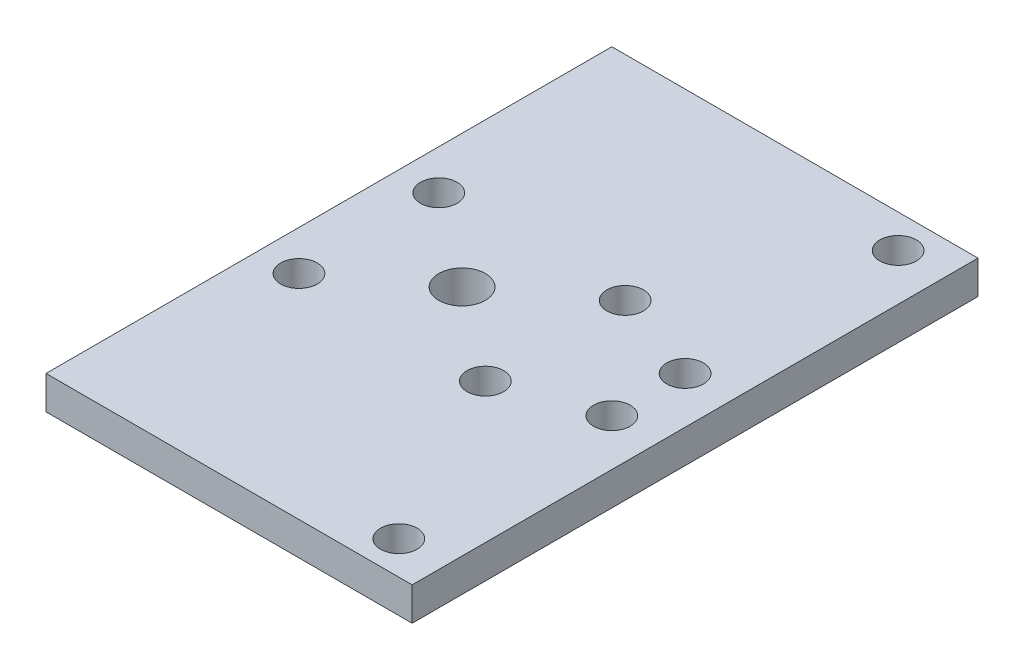
ISO-10303-21;
HEADER;
FILE_DESCRIPTION(('STEP AP214'),'2;1');
FILE_NAME('part.step','',(''),(''),'','','');
FILE_SCHEMA(('AUTOMOTIVE_DESIGN { 1 0 10303 214 1 1 1 1 }'));
ENDSEC;
DATA;
#1=APPLICATION_CONTEXT('core data for automotive mechanical design processes');
#2=APPLICATION_PROTOCOL_DEFINITION('international standard','automotive_design',2000,#1);
#3=PRODUCT_CONTEXT('',#1,'mechanical');
#4=PRODUCT('Part','Part','',(#3));
#5=PRODUCT_RELATED_PRODUCT_CATEGORY('part','',(#4));
#6=PRODUCT_DEFINITION_FORMATION('','',#4);
#7=PRODUCT_DEFINITION_CONTEXT('part definition',#1,'design');
#8=PRODUCT_DEFINITION('design','',#6,#7);
#9=PRODUCT_DEFINITION_SHAPE('','',#8);
#10=(LENGTH_UNIT() NAMED_UNIT(*) SI_UNIT(.MILLI.,.METRE.));
#11=(NAMED_UNIT(*) PLANE_ANGLE_UNIT() SI_UNIT($,.RADIAN.));
#12=(NAMED_UNIT(*) SI_UNIT($,.STERADIAN.) SOLID_ANGLE_UNIT());
#13=UNCERTAINTY_MEASURE_WITH_UNIT(LENGTH_MEASURE(1.E-05),#10,'distance_accuracy_value','');
#14=(GEOMETRIC_REPRESENTATION_CONTEXT(3) GLOBAL_UNCERTAINTY_ASSIGNED_CONTEXT((#13)) GLOBAL_UNIT_ASSIGNED_CONTEXT((#10,
#11,#12)) REPRESENTATION_CONTEXT('',''));
#15=CARTESIAN_POINT('',(0.,0.,0.));
#16=DIRECTION('',(0.,0.,1.));
#17=DIRECTION('',(1.,0.,0.));
#18=AXIS2_PLACEMENT_3D('',#15,#16,#17);
#19=CARTESIAN_POINT('',(-20.,5.,42.5));
#20=DIRECTION('',(-1.,0.,0.));
#21=DIRECTION('',(0.,0.,1.));
#22=AXIS2_PLACEMENT_3D('',#19,#20,#21);
#23=PLANE('',#22);
#24=DIRECTION('',(0.,0.,-1.));
#25=VECTOR('',#24,1.);
#26=CARTESIAN_POINT('',(-20.,0.,42.5));
#27=LINE('',#26,#25);
#28=CARTESIAN_POINT('',(-20.,0.,42.5));
#29=VERTEX_POINT('',#28);
#30=CARTESIAN_POINT('',(-20.,0.,-42.5));
#31=VERTEX_POINT('',#30);
#32=EDGE_CURVE('E97',#29,#31,#27,.T.);
#33=ORIENTED_EDGE('',*,*,#32,.F.);
#34=DIRECTION('',(0.,-1.,0.));
#35=VECTOR('',#34,1.);
#36=CARTESIAN_POINT('',(-20.,5.,42.5));
#37=LINE('',#36,#35);
#38=CARTESIAN_POINT('',(-20.,5.,42.5));
#39=VERTEX_POINT('',#38);
#40=EDGE_CURVE('E11',#39,#29,#37,.T.);
#41=ORIENTED_EDGE('',*,*,#40,.F.);
#42=DIRECTION('',(0.,0.,-1.));
#43=VECTOR('',#42,1.);
#44=CARTESIAN_POINT('',(-20.,5.,42.5));
#45=LINE('',#44,#43);
#46=CARTESIAN_POINT('',(-20.,5.,-42.5));
#47=VERTEX_POINT('',#46);
#48=EDGE_CURVE('E90',#39,#47,#45,.T.);
#49=ORIENTED_EDGE('',*,*,#48,.T.);
#50=DIRECTION('',(0.,-1.,0.));
#51=VECTOR('',#50,1.);
#52=CARTESIAN_POINT('',(-20.,5.,-42.5));
#53=LINE('',#52,#51);
#54=EDGE_CURVE('E35',#47,#31,#53,.T.);
#55=ORIENTED_EDGE('',*,*,#54,.T.);
#56=EDGE_LOOP('',(#33,#41,#49,#55));
#57=FACE_BOUND('',#56,.T.);
#58=ADVANCED_FACE('F32',(#57),#23,.T.);
#59=CARTESIAN_POINT('',(35.,5.,42.5));
#60=DIRECTION('',(0.,0.,1.));
#61=DIRECTION('',(1.,0.,0.));
#62=AXIS2_PLACEMENT_3D('',#59,#60,#61);
#63=PLANE('',#62);
#64=DIRECTION('',(-1.,0.,0.));
#65=VECTOR('',#64,1.);
#66=CARTESIAN_POINT('',(35.,0.,42.5));
#67=LINE('',#66,#65);
#68=CARTESIAN_POINT('',(35.,0.,42.5));
#69=VERTEX_POINT('',#68);
#70=EDGE_CURVE('E92',#69,#29,#67,.T.);
#71=ORIENTED_EDGE('',*,*,#70,.F.);
#72=DIRECTION('',(0.,-1.,0.));
#73=VECTOR('',#72,1.);
#74=CARTESIAN_POINT('',(35.,5.,42.5));
#75=LINE('',#74,#73);
#76=CARTESIAN_POINT('',(35.,5.,42.5));
#77=VERTEX_POINT('',#76);
#78=EDGE_CURVE('E41',#77,#69,#75,.T.);
#79=ORIENTED_EDGE('',*,*,#78,.F.);
#80=DIRECTION('',(-1.,0.,0.));
#81=VECTOR('',#80,1.);
#82=CARTESIAN_POINT('',(35.,5.,42.5));
#83=LINE('',#82,#81);
#84=EDGE_CURVE('E87',#77,#39,#83,.T.);
#85=ORIENTED_EDGE('',*,*,#84,.T.);
#86=ORIENTED_EDGE('',*,*,#40,.T.);
#87=EDGE_LOOP('',(#71,#79,#85,#86));
#88=FACE_BOUND('',#87,.T.);
#89=ADVANCED_FACE('F108',(#88),#63,.T.);
#90=CARTESIAN_POINT('',(35.,5.,-42.5));
#91=DIRECTION('',(1.,0.,0.));
#92=DIRECTION('',(0.,0.,-1.));
#93=AXIS2_PLACEMENT_3D('',#90,#91,#92);
#94=PLANE('',#93);
#95=DIRECTION('',(0.,0.,1.));
#96=VECTOR('',#95,1.);
#97=CARTESIAN_POINT('',(35.,0.,-42.5));
#98=LINE('',#97,#96);
#99=CARTESIAN_POINT('',(35.,0.,-42.5));
#100=VERTEX_POINT('',#99);
#101=EDGE_CURVE('E82',#100,#69,#98,.T.);
#102=ORIENTED_EDGE('',*,*,#101,.F.);
#103=DIRECTION('',(0.,-1.,0.));
#104=VECTOR('',#103,1.);
#105=CARTESIAN_POINT('',(35.,5.,-42.5));
#106=LINE('',#105,#104);
#107=CARTESIAN_POINT('',(35.,5.,-42.5));
#108=VERTEX_POINT('',#107);
#109=EDGE_CURVE('E77',#108,#100,#106,.T.);
#110=ORIENTED_EDGE('',*,*,#109,.F.);
#111=DIRECTION('',(0.,0.,1.));
#112=VECTOR('',#111,1.);
#113=CARTESIAN_POINT('',(35.,5.,-42.5));
#114=LINE('',#113,#112);
#115=EDGE_CURVE('E80',#108,#77,#114,.T.);
#116=ORIENTED_EDGE('',*,*,#115,.T.);
#117=ORIENTED_EDGE('',*,*,#78,.T.);
#118=EDGE_LOOP('',(#102,#110,#116,#117));
#119=FACE_BOUND('',#118,.T.);
#120=ADVANCED_FACE('F79',(#119),#94,.T.);
#121=CARTESIAN_POINT('',(-20.,5.,-42.5));
#122=DIRECTION('',(0.,0.,-1.));
#123=DIRECTION('',(-1.,0.,0.));
#124=AXIS2_PLACEMENT_3D('',#121,#122,#123);
#125=PLANE('',#124);
#126=DIRECTION('',(1.,0.,0.));
#127=VECTOR('',#126,1.);
#128=CARTESIAN_POINT('',(-20.,0.,-42.5));
#129=LINE('',#128,#127);
#130=EDGE_CURVE('E100',#31,#100,#129,.T.);
#131=ORIENTED_EDGE('',*,*,#130,.F.);
#132=ORIENTED_EDGE('',*,*,#54,.F.);
#133=DIRECTION('',(1.,0.,0.));
#134=VECTOR('',#133,1.);
#135=CARTESIAN_POINT('',(-20.,5.,-42.5));
#136=LINE('',#135,#134);
#137=EDGE_CURVE('E86',#47,#108,#136,.T.);
#138=ORIENTED_EDGE('',*,*,#137,.T.);
#139=ORIENTED_EDGE('',*,*,#109,.T.);
#140=EDGE_LOOP('',(#131,#132,#138,#139));
#141=FACE_BOUND('',#140,.T.);
#142=ADVANCED_FACE('F89',(#141),#125,.T.);
#143=CARTESIAN_POINT('',(0.,5.,0.));
#144=DIRECTION('',(0.,-1.,0.));
#145=DIRECTION('',(0.,0.,-1.));
#146=AXIS2_PLACEMENT_3D('',#143,#144,#145);
#147=PLANE('',#146);
#148=CARTESIAN_POINT('',(0.,5.,0.));
#149=DIRECTION('',(0.,-1.,0.));
#150=DIRECTION('',(0.,0.,1.));
#151=AXIS2_PLACEMENT_3D('',#148,#149,#150);
#152=CIRCLE('',#151,3.5);
#153=CARTESIAN_POINT('',(0.,5.,3.5));
#154=VERTEX_POINT('',#153);
#155=EDGE_CURVE('E169',#154,#154,#152,.T.);
#156=ORIENTED_EDGE('',*,*,#155,.T.);
#157=EDGE_LOOP('',(#156));
#158=FACE_BOUND('',#157,.T.);
#159=CARTESIAN_POINT('',(28.,5.,-37.5));
#160=DIRECTION('',(0.,-1.,0.));
#161=DIRECTION('',(0.,0.,1.));
#162=AXIS2_PLACEMENT_3D('',#159,#160,#161);
#163=CIRCLE('',#162,2.75);
#164=CARTESIAN_POINT('',(28.,5.,-34.75));
#165=VERTEX_POINT('',#164);
#166=EDGE_CURVE('E177',#165,#165,#163,.T.);
#167=ORIENTED_EDGE('',*,*,#166,.T.);
#168=EDGE_LOOP('',(#167));
#169=FACE_BOUND('',#168,.T.);
#170=CARTESIAN_POINT('',(28.,5.,-5.50000000000001));
#171=DIRECTION('',(0.,-1.,0.));
#172=DIRECTION('',(0.,0.,1.));
#173=AXIS2_PLACEMENT_3D('',#170,#171,#172);
#174=CIRCLE('',#173,2.74999999999999);
#175=CARTESIAN_POINT('',(28.,5.,-2.75000000000002));
#176=VERTEX_POINT('',#175);
#177=EDGE_CURVE('E183',#176,#176,#174,.T.);
#178=ORIENTED_EDGE('',*,*,#177,.T.);
#179=EDGE_LOOP('',(#178));
#180=FACE_BOUND('',#179,.T.);
#181=CARTESIAN_POINT('',(28.,5.,5.50000000000001));
#182=DIRECTION('',(0.,-1.,0.));
#183=DIRECTION('',(0.,0.,1.));
#184=AXIS2_PLACEMENT_3D('',#181,#182,#183);
#185=CIRCLE('',#184,2.74999999999999);
#186=CARTESIAN_POINT('',(28.,5.,8.25));
#187=VERTEX_POINT('',#186);
#188=EDGE_CURVE('E189',#187,#187,#185,.T.);
#189=ORIENTED_EDGE('',*,*,#188,.T.);
#190=EDGE_LOOP('',(#189));
#191=FACE_BOUND('',#190,.T.);
#192=CARTESIAN_POINT('',(28.,5.,37.5));
#193=DIRECTION('',(0.,-1.,0.));
#194=DIRECTION('',(0.,0.,1.));
#195=AXIS2_PLACEMENT_3D('',#192,#193,#194);
#196=CIRCLE('',#195,2.75);
#197=CARTESIAN_POINT('',(28.,5.,40.25));
#198=VERTEX_POINT('',#197);
#199=EDGE_CURVE('E195',#198,#198,#196,.T.);
#200=ORIENTED_EDGE('',*,*,#199,.T.);
#201=EDGE_LOOP('',(#200));
#202=FACE_BOUND('',#201,.T.);
#203=CARTESIAN_POINT('',(14.,5.,-10.5));
#204=DIRECTION('',(0.,-1.,0.));
#205=DIRECTION('',(0.,0.,1.));
#206=AXIS2_PLACEMENT_3D('',#203,#204,#205);
#207=CIRCLE('',#206,2.75);
#208=CARTESIAN_POINT('',(14.,5.,-7.75000000000001));
#209=VERTEX_POINT('',#208);
#210=EDGE_CURVE('E201',#209,#209,#207,.T.);
#211=ORIENTED_EDGE('',*,*,#210,.T.);
#212=EDGE_LOOP('',(#211));
#213=FACE_BOUND('',#212,.T.);
#214=CARTESIAN_POINT('',(-14.,5.,-10.5));
#215=DIRECTION('',(0.,-1.,0.));
#216=DIRECTION('',(0.,0.,1.));
#217=AXIS2_PLACEMENT_3D('',#214,#215,#216);
#218=CIRCLE('',#217,2.75);
#219=CARTESIAN_POINT('',(-14.,5.,-7.75000000000001));
#220=VERTEX_POINT('',#219);
#221=EDGE_CURVE('E207',#220,#220,#218,.T.);
#222=ORIENTED_EDGE('',*,*,#221,.T.);
#223=EDGE_LOOP('',(#222));
#224=FACE_BOUND('',#223,.T.);
#225=CARTESIAN_POINT('',(-14.,5.,10.5));
#226=DIRECTION('',(0.,-1.,0.));
#227=DIRECTION('',(0.,0.,1.));
#228=AXIS2_PLACEMENT_3D('',#225,#226,#227);
#229=CIRCLE('',#228,2.75);
#230=CARTESIAN_POINT('',(-14.,5.,13.25));
#231=VERTEX_POINT('',#230);
#232=EDGE_CURVE('E213',#231,#231,#229,.T.);
#233=ORIENTED_EDGE('',*,*,#232,.T.);
#234=EDGE_LOOP('',(#233));
#235=FACE_BOUND('',#234,.T.);
#236=CARTESIAN_POINT('',(14.,5.,10.5));
#237=DIRECTION('',(0.,-1.,0.));
#238=DIRECTION('',(0.,0.,1.));
#239=AXIS2_PLACEMENT_3D('',#236,#237,#238);
#240=CIRCLE('',#239,2.75);
#241=CARTESIAN_POINT('',(14.,5.,13.25));
#242=VERTEX_POINT('',#241);
#243=EDGE_CURVE('E101',#242,#242,#240,.T.);
#244=ORIENTED_EDGE('',*,*,#243,.T.);
#245=EDGE_LOOP('',(#244));
#246=FACE_BOUND('',#245,.T.);
#247=ORIENTED_EDGE('',*,*,#48,.F.);
#248=ORIENTED_EDGE('',*,*,#84,.F.);
#249=ORIENTED_EDGE('',*,*,#115,.F.);
#250=ORIENTED_EDGE('',*,*,#137,.F.);
#251=EDGE_LOOP('',(#247,#248,#249,#250));
#252=FACE_BOUND('',#251,.T.);
#253=ADVANCED_FACE('F85',(#158,#169,#180,#191,#202,#213,#224,#235,#246,#252),#147,.F.);
#254=CARTESIAN_POINT('',(0.,0.,0.));
#255=DIRECTION('',(0.,-1.,0.));
#256=DIRECTION('',(0.,0.,-1.));
#257=AXIS2_PLACEMENT_3D('',#254,#255,#256);
#258=PLANE('',#257);
#259=CARTESIAN_POINT('',(0.,0.,0.));
#260=DIRECTION('',(0.,-1.,0.));
#261=DIRECTION('',(0.,0.,1.));
#262=AXIS2_PLACEMENT_3D('',#259,#260,#261);
#263=CIRCLE('',#262,3.5);
#264=CARTESIAN_POINT('',(0.,0.,3.5));
#265=VERTEX_POINT('',#264);
#266=EDGE_CURVE('E172',#265,#265,#263,.T.);
#267=ORIENTED_EDGE('',*,*,#266,.F.);
#268=EDGE_LOOP('',(#267));
#269=FACE_BOUND('',#268,.T.);
#270=CARTESIAN_POINT('',(28.,0.,-37.5));
#271=DIRECTION('',(0.,-1.,0.));
#272=DIRECTION('',(0.,0.,1.));
#273=AXIS2_PLACEMENT_3D('',#270,#271,#272);
#274=CIRCLE('',#273,2.75);
#275=CARTESIAN_POINT('',(28.,0.,-34.75));
#276=VERTEX_POINT('',#275);
#277=EDGE_CURVE('E174',#276,#276,#274,.T.);
#278=ORIENTED_EDGE('',*,*,#277,.F.);
#279=EDGE_LOOP('',(#278));
#280=FACE_BOUND('',#279,.T.);
#281=CARTESIAN_POINT('',(28.,0.,-5.50000000000001));
#282=DIRECTION('',(0.,-1.,0.));
#283=DIRECTION('',(0.,0.,1.));
#284=AXIS2_PLACEMENT_3D('',#281,#282,#283);
#285=CIRCLE('',#284,2.74999999999999);
#286=CARTESIAN_POINT('',(28.,0.,-2.75000000000002));
#287=VERTEX_POINT('',#286);
#288=EDGE_CURVE('E180',#287,#287,#285,.T.);
#289=ORIENTED_EDGE('',*,*,#288,.F.);
#290=EDGE_LOOP('',(#289));
#291=FACE_BOUND('',#290,.T.);
#292=CARTESIAN_POINT('',(28.,0.,5.50000000000001));
#293=DIRECTION('',(0.,-1.,0.));
#294=DIRECTION('',(0.,0.,1.));
#295=AXIS2_PLACEMENT_3D('',#292,#293,#294);
#296=CIRCLE('',#295,2.74999999999999);
#297=CARTESIAN_POINT('',(28.,0.,8.25));
#298=VERTEX_POINT('',#297);
#299=EDGE_CURVE('E186',#298,#298,#296,.T.);
#300=ORIENTED_EDGE('',*,*,#299,.F.);
#301=EDGE_LOOP('',(#300));
#302=FACE_BOUND('',#301,.T.);
#303=CARTESIAN_POINT('',(28.,0.,37.5));
#304=DIRECTION('',(0.,-1.,0.));
#305=DIRECTION('',(0.,0.,1.));
#306=AXIS2_PLACEMENT_3D('',#303,#304,#305);
#307=CIRCLE('',#306,2.75);
#308=CARTESIAN_POINT('',(28.,0.,40.25));
#309=VERTEX_POINT('',#308);
#310=EDGE_CURVE('E192',#309,#309,#307,.T.);
#311=ORIENTED_EDGE('',*,*,#310,.F.);
#312=EDGE_LOOP('',(#311));
#313=FACE_BOUND('',#312,.T.);
#314=CARTESIAN_POINT('',(14.,0.,-10.5));
#315=DIRECTION('',(0.,-1.,0.));
#316=DIRECTION('',(0.,0.,1.));
#317=AXIS2_PLACEMENT_3D('',#314,#315,#316);
#318=CIRCLE('',#317,2.75);
#319=CARTESIAN_POINT('',(14.,0.,-7.75000000000001));
#320=VERTEX_POINT('',#319);
#321=EDGE_CURVE('E198',#320,#320,#318,.T.);
#322=ORIENTED_EDGE('',*,*,#321,.F.);
#323=EDGE_LOOP('',(#322));
#324=FACE_BOUND('',#323,.T.);
#325=CARTESIAN_POINT('',(-14.,0.,-10.5));
#326=DIRECTION('',(0.,-1.,0.));
#327=DIRECTION('',(0.,0.,1.));
#328=AXIS2_PLACEMENT_3D('',#325,#326,#327);
#329=CIRCLE('',#328,2.75);
#330=CARTESIAN_POINT('',(-14.,0.,-7.75000000000001));
#331=VERTEX_POINT('',#330);
#332=EDGE_CURVE('E204',#331,#331,#329,.T.);
#333=ORIENTED_EDGE('',*,*,#332,.F.);
#334=EDGE_LOOP('',(#333));
#335=FACE_BOUND('',#334,.T.);
#336=CARTESIAN_POINT('',(-14.,0.,10.5));
#337=DIRECTION('',(0.,-1.,0.));
#338=DIRECTION('',(0.,0.,1.));
#339=AXIS2_PLACEMENT_3D('',#336,#337,#338);
#340=CIRCLE('',#339,2.75);
#341=CARTESIAN_POINT('',(-14.,0.,13.25));
#342=VERTEX_POINT('',#341);
#343=EDGE_CURVE('E210',#342,#342,#340,.T.);
#344=ORIENTED_EDGE('',*,*,#343,.F.);
#345=EDGE_LOOP('',(#344));
#346=FACE_BOUND('',#345,.T.);
#347=CARTESIAN_POINT('',(14.,0.,10.5));
#348=DIRECTION('',(0.,-1.,0.));
#349=DIRECTION('',(0.,0.,1.));
#350=AXIS2_PLACEMENT_3D('',#347,#348,#349);
#351=CIRCLE('',#350,2.75);
#352=CARTESIAN_POINT('',(14.,0.,13.25));
#353=VERTEX_POINT('',#352);
#354=EDGE_CURVE('E216',#353,#353,#351,.T.);
#355=ORIENTED_EDGE('',*,*,#354,.F.);
#356=EDGE_LOOP('',(#355));
#357=FACE_BOUND('',#356,.T.);
#358=ORIENTED_EDGE('',*,*,#32,.T.);
#359=ORIENTED_EDGE('',*,*,#130,.T.);
#360=ORIENTED_EDGE('',*,*,#101,.T.);
#361=ORIENTED_EDGE('',*,*,#70,.T.);
#362=EDGE_LOOP('',(#358,#359,#360,#361));
#363=FACE_BOUND('',#362,.T.);
#364=ADVANCED_FACE('F107',(#269,#280,#291,#302,#313,#324,#335,#346,#357,#363),#258,.T.);
#365=CARTESIAN_POINT('',(14.,5.,10.5));
#366=DIRECTION('',(0.,-1.,0.));
#367=DIRECTION('',(0.,0.,-1.));
#368=AXIS2_PLACEMENT_3D('',#365,#366,#367);
#369=CYLINDRICAL_SURFACE('',#368,2.75);
#370=ORIENTED_EDGE('',*,*,#243,.F.);
#371=EDGE_LOOP('',(#370));
#372=FACE_BOUND('',#371,.T.);
#373=ORIENTED_EDGE('',*,*,#354,.T.);
#374=EDGE_LOOP('',(#373));
#375=FACE_BOUND('',#374,.T.);
#376=ADVANCED_FACE('F126',(#372,#375),#369,.F.);
#377=CARTESIAN_POINT('',(-14.,5.,10.5));
#378=DIRECTION('',(0.,-1.,0.));
#379=DIRECTION('',(0.,0.,-1.));
#380=AXIS2_PLACEMENT_3D('',#377,#378,#379);
#381=CYLINDRICAL_SURFACE('',#380,2.75);
#382=ORIENTED_EDGE('',*,*,#232,.F.);
#383=EDGE_LOOP('',(#382));
#384=FACE_BOUND('',#383,.T.);
#385=ORIENTED_EDGE('',*,*,#343,.T.);
#386=EDGE_LOOP('',(#385));
#387=FACE_BOUND('',#386,.T.);
#388=ADVANCED_FACE('F133',(#384,#387),#381,.F.);
#389=CARTESIAN_POINT('',(-14.,5.,-10.5));
#390=DIRECTION('',(0.,-1.,0.));
#391=DIRECTION('',(0.,0.,-1.));
#392=AXIS2_PLACEMENT_3D('',#389,#390,#391);
#393=CYLINDRICAL_SURFACE('',#392,2.75);
#394=ORIENTED_EDGE('',*,*,#221,.F.);
#395=EDGE_LOOP('',(#394));
#396=FACE_BOUND('',#395,.T.);
#397=ORIENTED_EDGE('',*,*,#332,.T.);
#398=EDGE_LOOP('',(#397));
#399=FACE_BOUND('',#398,.T.);
#400=ADVANCED_FACE('F137',(#396,#399),#393,.F.);
#401=CARTESIAN_POINT('',(14.,5.,-10.5));
#402=DIRECTION('',(0.,-1.,0.));
#403=DIRECTION('',(0.,0.,-1.));
#404=AXIS2_PLACEMENT_3D('',#401,#402,#403);
#405=CYLINDRICAL_SURFACE('',#404,2.75);
#406=ORIENTED_EDGE('',*,*,#210,.F.);
#407=EDGE_LOOP('',(#406));
#408=FACE_BOUND('',#407,.T.);
#409=ORIENTED_EDGE('',*,*,#321,.T.);
#410=EDGE_LOOP('',(#409));
#411=FACE_BOUND('',#410,.T.);
#412=ADVANCED_FACE('F141',(#408,#411),#405,.F.);
#413=CARTESIAN_POINT('',(28.,5.,37.5));
#414=DIRECTION('',(0.,-1.,0.));
#415=DIRECTION('',(0.,0.,-1.));
#416=AXIS2_PLACEMENT_3D('',#413,#414,#415);
#417=CYLINDRICAL_SURFACE('',#416,2.75);
#418=ORIENTED_EDGE('',*,*,#199,.F.);
#419=EDGE_LOOP('',(#418));
#420=FACE_BOUND('',#419,.T.);
#421=ORIENTED_EDGE('',*,*,#310,.T.);
#422=EDGE_LOOP('',(#421));
#423=FACE_BOUND('',#422,.T.);
#424=ADVANCED_FACE('F145',(#420,#423),#417,.F.);
#425=CARTESIAN_POINT('',(28.,5.,5.50000000000001));
#426=DIRECTION('',(0.,-1.,0.));
#427=DIRECTION('',(0.,0.,-1.));
#428=AXIS2_PLACEMENT_3D('',#425,#426,#427);
#429=CYLINDRICAL_SURFACE('',#428,2.74999999999999);
#430=ORIENTED_EDGE('',*,*,#188,.F.);
#431=EDGE_LOOP('',(#430));
#432=FACE_BOUND('',#431,.T.);
#433=ORIENTED_EDGE('',*,*,#299,.T.);
#434=EDGE_LOOP('',(#433));
#435=FACE_BOUND('',#434,.T.);
#436=ADVANCED_FACE('F149',(#432,#435),#429,.F.);
#437=CARTESIAN_POINT('',(28.,5.,-5.50000000000001));
#438=DIRECTION('',(0.,-1.,0.));
#439=DIRECTION('',(0.,0.,-1.));
#440=AXIS2_PLACEMENT_3D('',#437,#438,#439);
#441=CYLINDRICAL_SURFACE('',#440,2.74999999999999);
#442=ORIENTED_EDGE('',*,*,#177,.F.);
#443=EDGE_LOOP('',(#442));
#444=FACE_BOUND('',#443,.T.);
#445=ORIENTED_EDGE('',*,*,#288,.T.);
#446=EDGE_LOOP('',(#445));
#447=FACE_BOUND('',#446,.T.);
#448=ADVANCED_FACE('F153',(#444,#447),#441,.F.);
#449=CARTESIAN_POINT('',(28.,5.,-37.5));
#450=DIRECTION('',(0.,-1.,0.));
#451=DIRECTION('',(0.,0.,-1.));
#452=AXIS2_PLACEMENT_3D('',#449,#450,#451);
#453=CYLINDRICAL_SURFACE('',#452,2.75);
#454=ORIENTED_EDGE('',*,*,#166,.F.);
#455=EDGE_LOOP('',(#454));
#456=FACE_BOUND('',#455,.T.);
#457=ORIENTED_EDGE('',*,*,#277,.T.);
#458=EDGE_LOOP('',(#457));
#459=FACE_BOUND('',#458,.T.);
#460=ADVANCED_FACE('F157',(#456,#459),#453,.F.);
#461=CARTESIAN_POINT('',(0.,5.,0.));
#462=DIRECTION('',(0.,-1.,0.));
#463=DIRECTION('',(0.,0.,-1.));
#464=AXIS2_PLACEMENT_3D('',#461,#462,#463);
#465=CYLINDRICAL_SURFACE('',#464,3.5);
#466=ORIENTED_EDGE('',*,*,#155,.F.);
#467=EDGE_LOOP('',(#466));
#468=FACE_BOUND('',#467,.T.);
#469=ORIENTED_EDGE('',*,*,#266,.T.);
#470=EDGE_LOOP('',(#469));
#471=FACE_BOUND('',#470,.T.);
#472=ADVANCED_FACE('F161',(#468,#471),#465,.F.);
#473=CLOSED_SHELL('',(#58,#89,#120,#142,#253,#364,#376,#388,#400,#412,#424,#436,#448,#460,#472));
#474=MANIFOLD_SOLID_BREP('B2',#473);
#475=ADVANCED_BREP_SHAPE_REPRESENTATION('',(#18,#474),#14);
#476=SHAPE_DEFINITION_REPRESENTATION(#9,#475);
ENDSEC;
END-ISO-10303-21;
